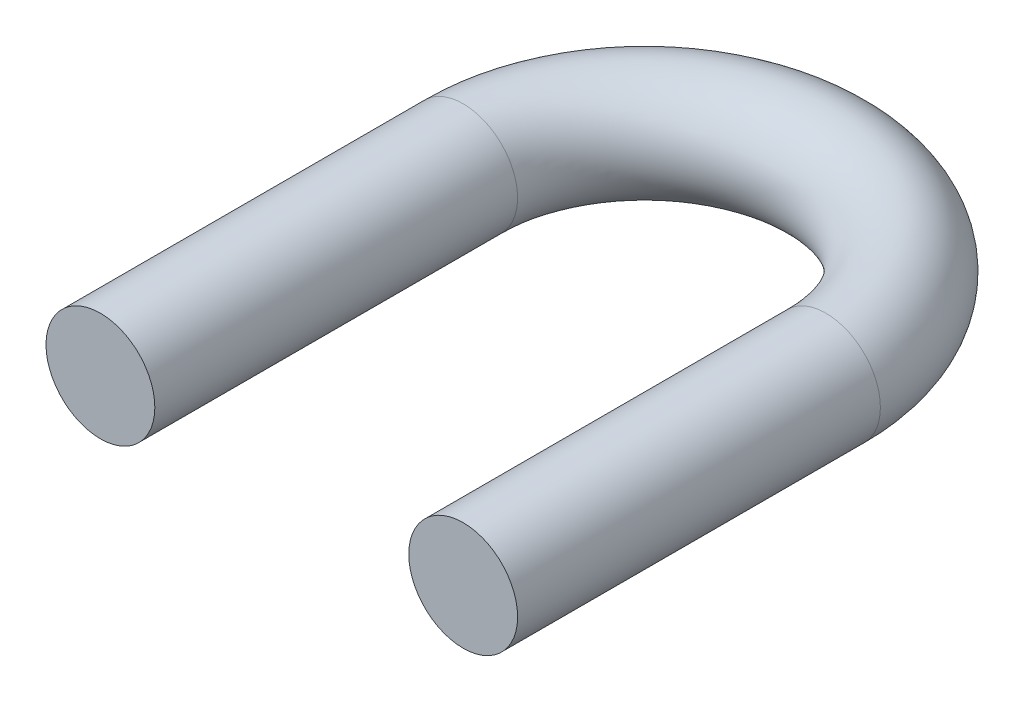
ISO-10303-21;
HEADER;
FILE_DESCRIPTION(('STEP AP214'),'2;1');
FILE_NAME('part.step','',(''),(''),'','','');
FILE_SCHEMA(('AUTOMOTIVE_DESIGN { 1 0 10303 214 1 1 1 1 }'));
ENDSEC;
DATA;
#1=APPLICATION_CONTEXT('core data for automotive mechanical design processes');
#2=APPLICATION_PROTOCOL_DEFINITION('international standard','automotive_design',2000,#1);
#3=PRODUCT_CONTEXT('',#1,'mechanical');
#4=PRODUCT('Part','Part','',(#3));
#5=PRODUCT_RELATED_PRODUCT_CATEGORY('part','',(#4));
#6=PRODUCT_DEFINITION_FORMATION('','',#4);
#7=PRODUCT_DEFINITION_CONTEXT('part definition',#1,'design');
#8=PRODUCT_DEFINITION('design','',#6,#7);
#9=PRODUCT_DEFINITION_SHAPE('','',#8);
#10=(LENGTH_UNIT() NAMED_UNIT(*) SI_UNIT(.MILLI.,.METRE.));
#11=(NAMED_UNIT(*) PLANE_ANGLE_UNIT() SI_UNIT($,.RADIAN.));
#12=(NAMED_UNIT(*) SI_UNIT($,.STERADIAN.) SOLID_ANGLE_UNIT());
#13=UNCERTAINTY_MEASURE_WITH_UNIT(LENGTH_MEASURE(1.E-05),#10,'distance_accuracy_value','');
#14=(GEOMETRIC_REPRESENTATION_CONTEXT(3) GLOBAL_UNCERTAINTY_ASSIGNED_CONTEXT((#13)) GLOBAL_UNIT_ASSIGNED_CONTEXT((#10,
#11,#12)) REPRESENTATION_CONTEXT('',''));
#15=CARTESIAN_POINT('',(0.,0.,0.));
#16=DIRECTION('',(0.,0.,1.));
#17=DIRECTION('',(1.,0.,0.));
#18=AXIS2_PLACEMENT_3D('',#15,#16,#17);
#19=CARTESIAN_POINT('',(-10.,0.,20.));
#20=DIRECTION('',(0.,0.,1.));
#21=DIRECTION('',(1.,0.,0.));
#22=AXIS2_PLACEMENT_3D('',#19,#20,#21);
#23=PLANE('',#22);
#24=CARTESIAN_POINT('',(-10.,0.,20.));
#25=DIRECTION('',(0.,0.,1.));
#26=DIRECTION('',(1.,0.,0.));
#27=AXIS2_PLACEMENT_3D('',#24,#25,#26);
#28=CIRCLE('',#27,3.);
#29=CARTESIAN_POINT('',(-7.,0.,20.));
#30=VERTEX_POINT('',#29);
#31=EDGE_CURVE('E61',#30,#30,#28,.T.);
#32=ORIENTED_EDGE('',*,*,#31,.T.);
#33=EDGE_LOOP('',(#32));
#34=FACE_BOUND('',#33,.T.);
#35=ADVANCED_FACE('F47',(#34),#23,.T.);
#36=CARTESIAN_POINT('',(10.,0.,20.));
#37=DIRECTION('',(0.,0.,-1.));
#38=DIRECTION('',(-1.,0.,0.));
#39=AXIS2_PLACEMENT_3D('',#36,#37,#38);
#40=PLANE('',#39);
#41=CARTESIAN_POINT('',(10.,0.,20.));
#42=DIRECTION('',(0.,0.,-1.));
#43=DIRECTION('',(-1.,0.,0.));
#44=AXIS2_PLACEMENT_3D('',#41,#42,#43);
#45=CIRCLE('',#44,3.);
#46=CARTESIAN_POINT('',(7.,0.,20.));
#47=VERTEX_POINT('',#46);
#48=EDGE_CURVE('E11',#47,#47,#45,.T.);
#49=ORIENTED_EDGE('',*,*,#48,.F.);
#50=EDGE_LOOP('',(#49));
#51=FACE_BOUND('',#50,.T.);
#52=ADVANCED_FACE('F71',(#51),#40,.F.);
#53=CARTESIAN_POINT('',(-10.,0.,20.));
#54=DIRECTION('',(0.,0.,-1.));
#55=DIRECTION('',(-1.,0.,0.));
#56=AXIS2_PLACEMENT_3D('',#53,#54,#55);
#57=CYLINDRICAL_SURFACE('',#56,3.);
#58=CARTESIAN_POINT('',(-10.,0.,0.));
#59=DIRECTION('',(0.,0.,1.));
#60=DIRECTION('',(1.,0.,0.));
#61=AXIS2_PLACEMENT_3D('',#58,#59,#60);
#62=CIRCLE('',#61,3.);
#63=CARTESIAN_POINT('',(-13.,0.,0.));
#64=VERTEX_POINT('',#63);
#65=EDGE_CURVE('E57',#64,#64,#62,.T.);
#66=ORIENTED_EDGE('',*,*,#65,.T.);
#67=EDGE_LOOP('',(#66));
#68=FACE_BOUND('',#67,.T.);
#69=ORIENTED_EDGE('',*,*,#31,.F.);
#70=EDGE_LOOP('',(#69));
#71=FACE_BOUND('',#70,.T.);
#72=ADVANCED_FACE('F68',(#68,#71),#57,.T.);
#73=CARTESIAN_POINT('',(0.,0.,0.));
#74=DIRECTION('',(0.,-1.,0.));
#75=DIRECTION('',(0.,0.,-1.));
#76=AXIS2_PLACEMENT_3D('',#73,#74,#75);
#77=TOROIDAL_SURFACE('',#76,10.,3.);
#78=CARTESIAN_POINT('',(10.,0.,0.));
#79=DIRECTION('',(0.,0.,-1.));
#80=DIRECTION('',(-1.,0.,0.));
#81=AXIS2_PLACEMENT_3D('',#78,#79,#80);
#82=CIRCLE('',#81,3.);
#83=CARTESIAN_POINT('',(13.,0.,0.));
#84=VERTEX_POINT('',#83);
#85=EDGE_CURVE('E53',#84,#84,#82,.T.);
#86=CARTESIAN_POINT('',(0.,0.,0.));
#87=DIRECTION('',(0.,-1.,0.));
#88=DIRECTION('',(0.,0.,-1.));
#89=AXIS2_PLACEMENT_3D('',#86,#87,#88);
#90=CIRCLE('',#89,13.);
#91=EDGE_CURVE('',#64,#84,#90,.T.);
#92=ORIENTED_EDGE('',*,*,#65,.F.);
#93=ORIENTED_EDGE('',*,*,#85,.T.);
#94=ORIENTED_EDGE('',*,*,#91,.T.);
#95=ORIENTED_EDGE('',*,*,#91,.F.);
#96=EDGE_LOOP('',(#92,#94,#93,#95));
#97=FACE_BOUND('',#96,.T.);
#98=ADVANCED_FACE('F70',(#97),#77,.T.);
#99=CARTESIAN_POINT('',(10.,0.,0.));
#100=DIRECTION('',(0.,0.,1.));
#101=DIRECTION('',(1.,0.,0.));
#102=AXIS2_PLACEMENT_3D('',#99,#100,#101);
#103=CYLINDRICAL_SURFACE('',#102,3.);
#104=ORIENTED_EDGE('',*,*,#48,.T.);
#105=EDGE_LOOP('',(#104));
#106=FACE_BOUND('',#105,.T.);
#107=ORIENTED_EDGE('',*,*,#85,.F.);
#108=EDGE_LOOP('',(#107));
#109=FACE_BOUND('',#108,.T.);
#110=ADVANCED_FACE('F78',(#106,#109),#103,.T.);
#111=CLOSED_SHELL('',(#35,#52,#72,#98,#110));
#112=MANIFOLD_SOLID_BREP('B2',#111);
#113=ADVANCED_BREP_SHAPE_REPRESENTATION('',(#18,#112),#14);
#114=SHAPE_DEFINITION_REPRESENTATION(#9,#113);
ENDSEC;
END-ISO-10303-21;
